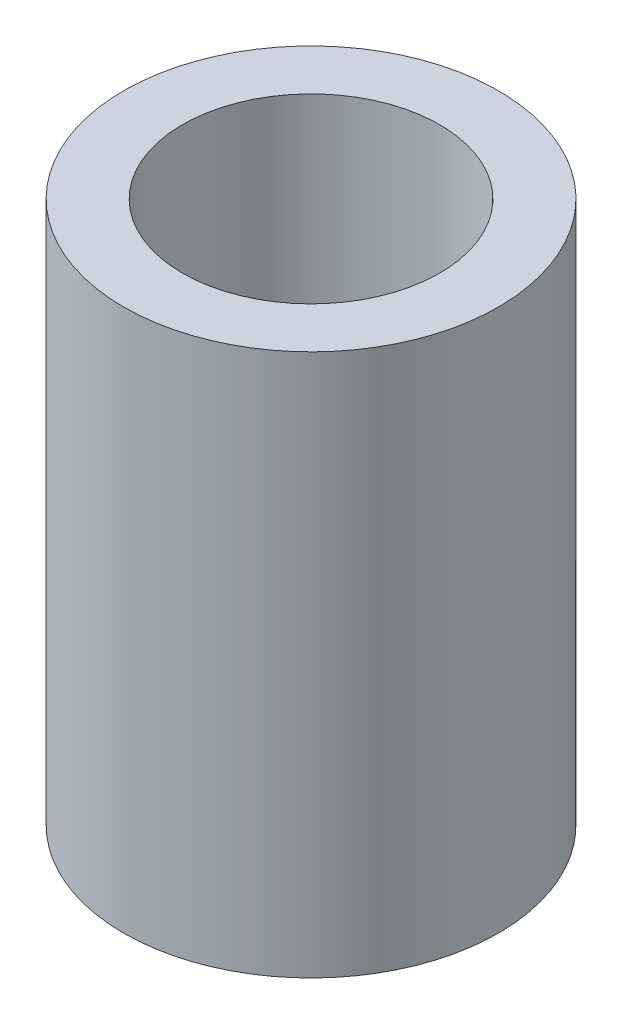
ISO-10303-21;
HEADER;
FILE_DESCRIPTION(('STEP AP214'),'2;1');
FILE_NAME('part.step','',(''),(''),'','','');
FILE_SCHEMA(('AUTOMOTIVE_DESIGN { 1 0 10303 214 1 1 1 1 }'));
ENDSEC;
DATA;
#1=APPLICATION_CONTEXT('core data for automotive mechanical design processes');
#2=APPLICATION_PROTOCOL_DEFINITION('international standard','automotive_design',2000,#1);
#3=PRODUCT_CONTEXT('',#1,'mechanical');
#4=PRODUCT('Part','Part','',(#3));
#5=PRODUCT_RELATED_PRODUCT_CATEGORY('part','',(#4));
#6=PRODUCT_DEFINITION_FORMATION('','',#4);
#7=PRODUCT_DEFINITION_CONTEXT('part definition',#1,'design');
#8=PRODUCT_DEFINITION('design','',#6,#7);
#9=PRODUCT_DEFINITION_SHAPE('','',#8);
#10=(LENGTH_UNIT() NAMED_UNIT(*) SI_UNIT(.MILLI.,.METRE.));
#11=(NAMED_UNIT(*) PLANE_ANGLE_UNIT() SI_UNIT($,.RADIAN.));
#12=(NAMED_UNIT(*) SI_UNIT($,.STERADIAN.) SOLID_ANGLE_UNIT());
#13=UNCERTAINTY_MEASURE_WITH_UNIT(LENGTH_MEASURE(1.E-05),#10,'distance_accuracy_value','');
#14=(GEOMETRIC_REPRESENTATION_CONTEXT(3) GLOBAL_UNCERTAINTY_ASSIGNED_CONTEXT((#13)) GLOBAL_UNIT_ASSIGNED_CONTEXT((#10,
#11,#12)) REPRESENTATION_CONTEXT('',''));
#15=CARTESIAN_POINT('',(0.,0.,0.));
#16=DIRECTION('',(0.,0.,1.));
#17=DIRECTION('',(1.,0.,0.));
#18=AXIS2_PLACEMENT_3D('',#15,#16,#17);
#19=CARTESIAN_POINT('',(0.,25.4,0.));
#20=DIRECTION('',(0.,1.,0.));
#21=DIRECTION('',(0.,0.,1.));
#22=AXIS2_PLACEMENT_3D('',#19,#20,#21);
#23=PLANE('',#22);
#24=CARTESIAN_POINT('',(0.,25.4,0.));
#25=DIRECTION('',(0.,1.,0.));
#26=DIRECTION('',(0.,0.,1.));
#27=AXIS2_PLACEMENT_3D('',#24,#25,#26);
#28=CIRCLE('',#27,8.775);
#29=CARTESIAN_POINT('',(0.,25.4,8.775));
#30=VERTEX_POINT('',#29);
#31=EDGE_CURVE('E10',#30,#30,#28,.T.);
#32=ORIENTED_EDGE('',*,*,#31,.T.);
#33=EDGE_LOOP('',(#32));
#34=FACE_BOUND('',#33,.T.);
#35=CARTESIAN_POINT('',(0.,25.4,0.));
#36=DIRECTION('',(0.,1.,0.));
#37=DIRECTION('',(0.,0.,1.));
#38=AXIS2_PLACEMENT_3D('',#35,#36,#37);
#39=CIRCLE('',#38,6.025);
#40=CARTESIAN_POINT('',(0.,25.4,6.025));
#41=VERTEX_POINT('',#40);
#42=EDGE_CURVE('E56',#41,#41,#39,.T.);
#43=ORIENTED_EDGE('',*,*,#42,.F.);
#44=EDGE_LOOP('',(#43));
#45=FACE_BOUND('',#44,.T.);
#46=ADVANCED_FACE('F43',(#34,#45),#23,.T.);
#47=CARTESIAN_POINT('',(0.,0.,0.));
#48=DIRECTION('',(0.,1.,0.));
#49=DIRECTION('',(0.,0.,1.));
#50=AXIS2_PLACEMENT_3D('',#47,#48,#49);
#51=PLANE('',#50);
#52=CARTESIAN_POINT('',(0.,0.,0.));
#53=DIRECTION('',(0.,1.,0.));
#54=DIRECTION('',(0.,0.,1.));
#55=AXIS2_PLACEMENT_3D('',#52,#53,#54);
#56=CIRCLE('',#55,8.775);
#57=CARTESIAN_POINT('',(0.,0.,8.775));
#58=VERTEX_POINT('',#57);
#59=EDGE_CURVE('E47',#58,#58,#56,.T.);
#60=ORIENTED_EDGE('',*,*,#59,.F.);
#61=EDGE_LOOP('',(#60));
#62=FACE_BOUND('',#61,.T.);
#63=CARTESIAN_POINT('',(0.,0.,0.));
#64=DIRECTION('',(0.,1.,0.));
#65=DIRECTION('',(0.,0.,1.));
#66=AXIS2_PLACEMENT_3D('',#63,#64,#65);
#67=CIRCLE('',#66,6.025);
#68=CARTESIAN_POINT('',(0.,0.,6.025));
#69=VERTEX_POINT('',#68);
#70=EDGE_CURVE('E58',#69,#69,#67,.T.);
#71=ORIENTED_EDGE('',*,*,#70,.T.);
#72=EDGE_LOOP('',(#71));
#73=FACE_BOUND('',#72,.T.);
#74=ADVANCED_FACE('F70',(#62,#73),#51,.F.);
#75=CARTESIAN_POINT('',(0.,25.4,0.));
#76=DIRECTION('',(0.,-1.,0.));
#77=DIRECTION('',(0.,0.,-1.));
#78=AXIS2_PLACEMENT_3D('',#75,#76,#77);
#79=CYLINDRICAL_SURFACE('',#78,8.775);
#80=ORIENTED_EDGE('',*,*,#31,.F.);
#81=EDGE_LOOP('',(#80));
#82=FACE_BOUND('',#81,.T.);
#83=ORIENTED_EDGE('',*,*,#59,.T.);
#84=EDGE_LOOP('',(#83));
#85=FACE_BOUND('',#84,.T.);
#86=ADVANCED_FACE('F45',(#82,#85),#79,.T.);
#87=CARTESIAN_POINT('',(0.,25.4,0.));
#88=DIRECTION('',(0.,-1.,0.));
#89=DIRECTION('',(0.,0.,-1.));
#90=AXIS2_PLACEMENT_3D('',#87,#88,#89);
#91=CYLINDRICAL_SURFACE('',#90,6.025);
#92=ORIENTED_EDGE('',*,*,#42,.T.);
#93=EDGE_LOOP('',(#92));
#94=FACE_BOUND('',#93,.T.);
#95=ORIENTED_EDGE('',*,*,#70,.F.);
#96=EDGE_LOOP('',(#95));
#97=FACE_BOUND('',#96,.T.);
#98=ADVANCED_FACE('F66',(#94,#97),#91,.F.);
#99=CLOSED_SHELL('',(#46,#74,#86,#98));
#100=MANIFOLD_SOLID_BREP('B2',#99);
#101=ADVANCED_BREP_SHAPE_REPRESENTATION('',(#18,#100),#14);
#102=SHAPE_DEFINITION_REPRESENTATION(#9,#101);
ENDSEC;
END-ISO-10303-21;
